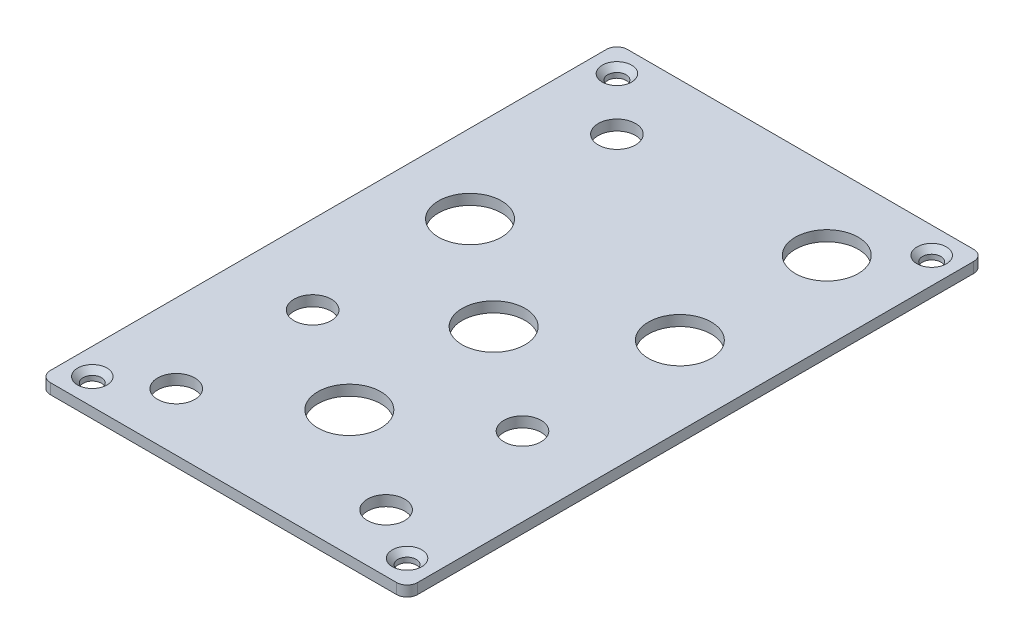
ISO-10303-21;
HEADER;
FILE_DESCRIPTION(('STEP AP214'),'2;1');
FILE_NAME('part.step','',(''),(''),'','','');
FILE_SCHEMA(('AUTOMOTIVE_DESIGN { 1 0 10303 214 1 1 1 1 }'));
ENDSEC;
DATA;
#1=APPLICATION_CONTEXT('core data for automotive mechanical design processes');
#2=APPLICATION_PROTOCOL_DEFINITION('international standard','automotive_design',2000,#1);
#3=PRODUCT_CONTEXT('',#1,'mechanical');
#4=PRODUCT('Part','Part','',(#3));
#5=PRODUCT_RELATED_PRODUCT_CATEGORY('part','',(#4));
#6=PRODUCT_DEFINITION_FORMATION('','',#4);
#7=PRODUCT_DEFINITION_CONTEXT('part definition',#1,'design');
#8=PRODUCT_DEFINITION('design','',#6,#7);
#9=PRODUCT_DEFINITION_SHAPE('','',#8);
#10=(LENGTH_UNIT() NAMED_UNIT(*) SI_UNIT(.MILLI.,.METRE.));
#11=(NAMED_UNIT(*) PLANE_ANGLE_UNIT() SI_UNIT($,.RADIAN.));
#12=(NAMED_UNIT(*) SI_UNIT($,.STERADIAN.) SOLID_ANGLE_UNIT());
#13=UNCERTAINTY_MEASURE_WITH_UNIT(LENGTH_MEASURE(1.E-05),#10,'distance_accuracy_value','');
#14=(GEOMETRIC_REPRESENTATION_CONTEXT(3) GLOBAL_UNCERTAINTY_ASSIGNED_CONTEXT((#13)) GLOBAL_UNIT_ASSIGNED_CONTEXT((#10,
#11,#12)) REPRESENTATION_CONTEXT('',''));
#15=CARTESIAN_POINT('',(0.,0.,0.));
#16=DIRECTION('',(0.,0.,1.));
#17=DIRECTION('',(1.,0.,0.));
#18=AXIS2_PLACEMENT_3D('',#15,#16,#17);
#19=CARTESIAN_POINT('',(-33.,2.,53.));
#20=DIRECTION('',(0.,-1.,0.));
#21=DIRECTION('',(0.,0.,-1.));
#22=AXIS2_PLACEMENT_3D('',#19,#20,#21);
#23=CYLINDRICAL_SURFACE('',#22,2.);
#24=DIRECTION('',(0.,-1.,0.));
#25=VECTOR('',#24,1.);
#26=CARTESIAN_POINT('',(-33.,2.,55.));
#27=LINE('',#26,#25);
#28=CARTESIAN_POINT('',(-33.,2.,55.));
#29=VERTEX_POINT('',#28);
#30=CARTESIAN_POINT('',(-33.,0.,55.));
#31=VERTEX_POINT('',#30);
#32=EDGE_CURVE('E218',#29,#31,#27,.T.);
#33=ORIENTED_EDGE('',*,*,#32,.F.);
#34=CARTESIAN_POINT('',(-33.,2.,53.));
#35=DIRECTION('',(0.,1.,0.));
#36=DIRECTION('',(0.,0.,1.));
#37=AXIS2_PLACEMENT_3D('',#34,#35,#36);
#38=CIRCLE('',#37,2.);
#39=CARTESIAN_POINT('',(-35.,2.,53.));
#40=VERTEX_POINT('',#39);
#41=EDGE_CURVE('E40',#40,#29,#38,.T.);
#42=ORIENTED_EDGE('',*,*,#41,.F.);
#43=DIRECTION('',(0.,-1.,0.));
#44=VECTOR('',#43,1.);
#45=CARTESIAN_POINT('',(-35.,2.,53.));
#46=LINE('',#45,#44);
#47=CARTESIAN_POINT('',(-35.,0.,53.));
#48=VERTEX_POINT('',#47);
#49=EDGE_CURVE('E221',#48,#40,#46,.F.);
#50=ORIENTED_EDGE('',*,*,#49,.F.);
#51=CARTESIAN_POINT('',(-33.,0.,53.));
#52=DIRECTION('',(0.,1.,0.));
#53=DIRECTION('',(0.,0.,1.));
#54=AXIS2_PLACEMENT_3D('',#51,#52,#53);
#55=CIRCLE('',#54,2.);
#56=EDGE_CURVE('E11',#31,#48,#55,.F.);
#57=ORIENTED_EDGE('',*,*,#56,.F.);
#58=EDGE_LOOP('',(#33,#42,#50,#57));
#59=FACE_BOUND('',#58,.T.);
#60=ADVANCED_FACE('F33',(#59),#23,.T.);
#61=CARTESIAN_POINT('',(33.,2.,53.));
#62=DIRECTION('',(0.,-1.,0.));
#63=DIRECTION('',(0.,0.,-1.));
#64=AXIS2_PLACEMENT_3D('',#61,#62,#63);
#65=CYLINDRICAL_SURFACE('',#64,2.);
#66=DIRECTION('',(0.,-1.,0.));
#67=VECTOR('',#66,1.);
#68=CARTESIAN_POINT('',(35.,2.,53.));
#69=LINE('',#68,#67);
#70=CARTESIAN_POINT('',(35.,2.,53.));
#71=VERTEX_POINT('',#70);
#72=CARTESIAN_POINT('',(35.,0.,53.));
#73=VERTEX_POINT('',#72);
#74=EDGE_CURVE('E207',#71,#73,#69,.T.);
#75=ORIENTED_EDGE('',*,*,#74,.F.);
#76=CARTESIAN_POINT('',(33.,2.,53.));
#77=DIRECTION('',(0.,1.,0.));
#78=DIRECTION('',(0.,0.,1.));
#79=AXIS2_PLACEMENT_3D('',#76,#77,#78);
#80=CIRCLE('',#79,2.);
#81=CARTESIAN_POINT('',(33.,2.,55.));
#82=VERTEX_POINT('',#81);
#83=EDGE_CURVE('E213',#82,#71,#80,.T.);
#84=ORIENTED_EDGE('',*,*,#83,.F.);
#85=DIRECTION('',(0.,-1.,0.));
#86=VECTOR('',#85,1.);
#87=CARTESIAN_POINT('',(33.,2.,55.));
#88=LINE('',#87,#86);
#89=CARTESIAN_POINT('',(33.,0.,55.));
#90=VERTEX_POINT('',#89);
#91=EDGE_CURVE('E210',#90,#82,#88,.F.);
#92=ORIENTED_EDGE('',*,*,#91,.F.);
#93=CARTESIAN_POINT('',(33.,0.,53.));
#94=DIRECTION('',(0.,1.,0.));
#95=DIRECTION('',(0.,0.,1.));
#96=AXIS2_PLACEMENT_3D('',#93,#94,#95);
#97=CIRCLE('',#96,2.);
#98=EDGE_CURVE('E215',#73,#90,#97,.F.);
#99=ORIENTED_EDGE('',*,*,#98,.F.);
#100=EDGE_LOOP('',(#75,#84,#92,#99));
#101=FACE_BOUND('',#100,.T.);
#102=ADVANCED_FACE('F311',(#101),#65,.T.);
#103=CARTESIAN_POINT('',(33.,2.,-53.));
#104=DIRECTION('',(0.,-1.,0.));
#105=DIRECTION('',(0.,0.,-1.));
#106=AXIS2_PLACEMENT_3D('',#103,#104,#105);
#107=CYLINDRICAL_SURFACE('',#106,2.);
#108=DIRECTION('',(0.,-1.,0.));
#109=VECTOR('',#108,1.);
#110=CARTESIAN_POINT('',(33.,2.,-55.));
#111=LINE('',#110,#109);
#112=CARTESIAN_POINT('',(33.,2.,-55.));
#113=VERTEX_POINT('',#112);
#114=CARTESIAN_POINT('',(33.,0.,-55.));
#115=VERTEX_POINT('',#114);
#116=EDGE_CURVE('E105',#113,#115,#111,.T.);
#117=ORIENTED_EDGE('',*,*,#116,.F.);
#118=CARTESIAN_POINT('',(33.,2.,-53.));
#119=DIRECTION('',(0.,1.,0.));
#120=DIRECTION('',(0.,0.,1.));
#121=AXIS2_PLACEMENT_3D('',#118,#119,#120);
#122=CIRCLE('',#121,2.);
#123=CARTESIAN_POINT('',(35.,2.,-53.));
#124=VERTEX_POINT('',#123);
#125=EDGE_CURVE('E202',#124,#113,#122,.T.);
#126=ORIENTED_EDGE('',*,*,#125,.F.);
#127=DIRECTION('',(0.,-1.,0.));
#128=VECTOR('',#127,1.);
#129=CARTESIAN_POINT('',(35.,2.,-53.));
#130=LINE('',#129,#128);
#131=CARTESIAN_POINT('',(35.,0.,-53.));
#132=VERTEX_POINT('',#131);
#133=EDGE_CURVE('E199',#132,#124,#130,.F.);
#134=ORIENTED_EDGE('',*,*,#133,.F.);
#135=CARTESIAN_POINT('',(33.,0.,-53.));
#136=DIRECTION('',(0.,1.,0.));
#137=DIRECTION('',(0.,0.,1.));
#138=AXIS2_PLACEMENT_3D('',#135,#136,#137);
#139=CIRCLE('',#138,2.);
#140=EDGE_CURVE('E204',#115,#132,#139,.F.);
#141=ORIENTED_EDGE('',*,*,#140,.F.);
#142=EDGE_LOOP('',(#117,#126,#134,#141));
#143=FACE_BOUND('',#142,.T.);
#144=ADVANCED_FACE('F316',(#143),#107,.T.);
#145=CARTESIAN_POINT('',(-33.,2.,-53.));
#146=DIRECTION('',(0.,-1.,0.));
#147=DIRECTION('',(0.,0.,-1.));
#148=AXIS2_PLACEMENT_3D('',#145,#146,#147);
#149=CYLINDRICAL_SURFACE('',#148,2.);
#150=DIRECTION('',(0.,-1.,0.));
#151=VECTOR('',#150,1.);
#152=CARTESIAN_POINT('',(-35.,2.,-53.));
#153=LINE('',#152,#151);
#154=CARTESIAN_POINT('',(-35.,2.,-53.));
#155=VERTEX_POINT('',#154);
#156=CARTESIAN_POINT('',(-35.,0.,-53.));
#157=VERTEX_POINT('',#156);
#158=EDGE_CURVE('E100',#155,#157,#153,.T.);
#159=ORIENTED_EDGE('',*,*,#158,.F.);
#160=CARTESIAN_POINT('',(-33.,2.,-53.));
#161=DIRECTION('',(0.,1.,0.));
#162=DIRECTION('',(0.,0.,1.));
#163=AXIS2_PLACEMENT_3D('',#160,#161,#162);
#164=CIRCLE('',#163,2.);
#165=CARTESIAN_POINT('',(-33.,2.,-55.));
#166=VERTEX_POINT('',#165);
#167=EDGE_CURVE('E106',#166,#155,#164,.T.);
#168=ORIENTED_EDGE('',*,*,#167,.F.);
#169=DIRECTION('',(0.,-1.,0.));
#170=VECTOR('',#169,1.);
#171=CARTESIAN_POINT('',(-33.,2.,-55.));
#172=LINE('',#171,#170);
#173=CARTESIAN_POINT('',(-33.,0.,-55.));
#174=VERTEX_POINT('',#173);
#175=EDGE_CURVE('E103',#174,#166,#172,.F.);
#176=ORIENTED_EDGE('',*,*,#175,.F.);
#177=CARTESIAN_POINT('',(-33.,0.,-53.));
#178=DIRECTION('',(0.,1.,0.));
#179=DIRECTION('',(0.,0.,1.));
#180=AXIS2_PLACEMENT_3D('',#177,#178,#179);
#181=CIRCLE('',#180,2.);
#182=EDGE_CURVE('E96',#157,#174,#181,.F.);
#183=ORIENTED_EDGE('',*,*,#182,.F.);
#184=EDGE_LOOP('',(#159,#168,#176,#183));
#185=FACE_BOUND('',#184,.T.);
#186=ADVANCED_FACE('F98',(#185),#149,.T.);
#187=CARTESIAN_POINT('',(-35.,2.,55.));
#188=DIRECTION('',(1.,0.,0.));
#189=DIRECTION('',(0.,0.,-1.));
#190=AXIS2_PLACEMENT_3D('',#187,#188,#189);
#191=PLANE('',#190);
#192=DIRECTION('',(0.,0.,1.));
#193=VECTOR('',#192,1.);
#194=CARTESIAN_POINT('',(-35.,0.,55.));
#195=LINE('',#194,#193);
#196=EDGE_CURVE('E111',#157,#48,#195,.T.);
#197=ORIENTED_EDGE('',*,*,#196,.T.);
#198=ORIENTED_EDGE('',*,*,#49,.T.);
#199=DIRECTION('',(0.,0.,1.));
#200=VECTOR('',#199,1.);
#201=CARTESIAN_POINT('',(-35.,2.,55.));
#202=LINE('',#201,#200);
#203=EDGE_CURVE('E113',#155,#40,#202,.T.);
#204=ORIENTED_EDGE('',*,*,#203,.F.);
#205=ORIENTED_EDGE('',*,*,#158,.T.);
#206=EDGE_LOOP('',(#197,#198,#204,#205));
#207=FACE_BOUND('',#206,.T.);
#208=ADVANCED_FACE('F110',(#207),#191,.F.);
#209=CARTESIAN_POINT('',(35.,2.,55.));
#210=DIRECTION('',(0.,0.,-1.));
#211=DIRECTION('',(-1.,0.,0.));
#212=AXIS2_PLACEMENT_3D('',#209,#210,#211);
#213=PLANE('',#212);
#214=DIRECTION('',(1.,0.,0.));
#215=VECTOR('',#214,1.);
#216=CARTESIAN_POINT('',(35.,2.,55.));
#217=LINE('',#216,#215);
#218=EDGE_CURVE('E225',#29,#82,#217,.T.);
#219=ORIENTED_EDGE('',*,*,#218,.F.);
#220=ORIENTED_EDGE('',*,*,#32,.T.);
#221=DIRECTION('',(1.,0.,0.));
#222=VECTOR('',#221,1.);
#223=CARTESIAN_POINT('',(35.,0.,55.));
#224=LINE('',#223,#222);
#225=EDGE_CURVE('E117',#31,#90,#224,.T.);
#226=ORIENTED_EDGE('',*,*,#225,.T.);
#227=ORIENTED_EDGE('',*,*,#91,.T.);
#228=EDGE_LOOP('',(#219,#220,#226,#227));
#229=FACE_BOUND('',#228,.T.);
#230=ADVANCED_FACE('F228',(#229),#213,.F.);
#231=CARTESIAN_POINT('',(35.,2.,55.));
#232=DIRECTION('',(-1.,0.,0.));
#233=DIRECTION('',(0.,0.,1.));
#234=AXIS2_PLACEMENT_3D('',#231,#232,#233);
#235=PLANE('',#234);
#236=DIRECTION('',(0.,0.,-1.));
#237=VECTOR('',#236,1.);
#238=CARTESIAN_POINT('',(35.,2.,55.));
#239=LINE('',#238,#237);
#240=EDGE_CURVE('E230',#71,#124,#239,.T.);
#241=ORIENTED_EDGE('',*,*,#240,.F.);
#242=ORIENTED_EDGE('',*,*,#74,.T.);
#243=DIRECTION('',(0.,0.,-1.));
#244=VECTOR('',#243,1.);
#245=CARTESIAN_POINT('',(35.,0.,55.));
#246=LINE('',#245,#244);
#247=EDGE_CURVE('E120',#73,#132,#246,.T.);
#248=ORIENTED_EDGE('',*,*,#247,.T.);
#249=ORIENTED_EDGE('',*,*,#133,.T.);
#250=EDGE_LOOP('',(#241,#242,#248,#249));
#251=FACE_BOUND('',#250,.T.);
#252=ADVANCED_FACE('F330',(#251),#235,.F.);
#253=CARTESIAN_POINT('',(35.,2.,-55.));
#254=DIRECTION('',(0.,0.,1.));
#255=DIRECTION('',(1.,0.,0.));
#256=AXIS2_PLACEMENT_3D('',#253,#254,#255);
#257=PLANE('',#256);
#258=DIRECTION('',(-1.,0.,0.));
#259=VECTOR('',#258,1.);
#260=CARTESIAN_POINT('',(35.,2.,-55.));
#261=LINE('',#260,#259);
#262=EDGE_CURVE('E114',#113,#166,#261,.T.);
#263=ORIENTED_EDGE('',*,*,#262,.F.);
#264=ORIENTED_EDGE('',*,*,#116,.T.);
#265=DIRECTION('',(-1.,0.,0.));
#266=VECTOR('',#265,1.);
#267=CARTESIAN_POINT('',(35.,0.,-55.));
#268=LINE('',#267,#266);
#269=EDGE_CURVE('E129',#115,#174,#268,.T.);
#270=ORIENTED_EDGE('',*,*,#269,.T.);
#271=ORIENTED_EDGE('',*,*,#175,.T.);
#272=EDGE_LOOP('',(#263,#264,#270,#271));
#273=FACE_BOUND('',#272,.T.);
#274=ADVANCED_FACE('F268',(#273),#257,.F.);
#275=CARTESIAN_POINT('',(0.,2.,0.));
#276=DIRECTION('',(0.,1.,0.));
#277=DIRECTION('',(0.,0.,1.));
#278=AXIS2_PLACEMENT_3D('',#275,#276,#277);
#279=PLANE('',#278);
#280=CARTESIAN_POINT('',(-30.,2.,50.));
#281=DIRECTION('',(0.,1.,0.));
#282=DIRECTION('',(0.,0.,1.));
#283=AXIS2_PLACEMENT_3D('',#280,#281,#282);
#284=CIRCLE('',#283,2.8);
#285=CARTESIAN_POINT('',(-30.,2.,52.8));
#286=VERTEX_POINT('',#285);
#287=EDGE_CURVE('E193',#286,#286,#284,.T.);
#288=ORIENTED_EDGE('',*,*,#287,.F.);
#289=EDGE_LOOP('',(#288));
#290=FACE_BOUND('',#289,.T.);
#291=CARTESIAN_POINT('',(30.,2.,50.));
#292=DIRECTION('',(0.,1.,0.));
#293=DIRECTION('',(0.,0.,1.));
#294=AXIS2_PLACEMENT_3D('',#291,#292,#293);
#295=CIRCLE('',#294,2.8);
#296=CARTESIAN_POINT('',(30.,2.,52.8));
#297=VERTEX_POINT('',#296);
#298=EDGE_CURVE('E190',#297,#297,#295,.T.);
#299=ORIENTED_EDGE('',*,*,#298,.F.);
#300=EDGE_LOOP('',(#299));
#301=FACE_BOUND('',#300,.T.);
#302=CARTESIAN_POINT('',(30.,2.,-50.));
#303=DIRECTION('',(0.,1.,0.));
#304=DIRECTION('',(0.,0.,1.));
#305=AXIS2_PLACEMENT_3D('',#302,#303,#304);
#306=CIRCLE('',#305,2.8);
#307=CARTESIAN_POINT('',(30.,2.,-47.2));
#308=VERTEX_POINT('',#307);
#309=EDGE_CURVE('E186',#308,#308,#306,.T.);
#310=ORIENTED_EDGE('',*,*,#309,.F.);
#311=EDGE_LOOP('',(#310));
#312=FACE_BOUND('',#311,.T.);
#313=CARTESIAN_POINT('',(-30.,2.,-50.));
#314=DIRECTION('',(0.,1.,0.));
#315=DIRECTION('',(0.,0.,1.));
#316=AXIS2_PLACEMENT_3D('',#313,#314,#315);
#317=CIRCLE('',#316,2.8);
#318=CARTESIAN_POINT('',(-30.,2.,-47.2));
#319=VERTEX_POINT('',#318);
#320=EDGE_CURVE('E182',#319,#319,#317,.T.);
#321=ORIENTED_EDGE('',*,*,#320,.F.);
#322=EDGE_LOOP('',(#321));
#323=FACE_BOUND('',#322,.T.);
#324=CARTESIAN_POINT('',(0.,2.,3.49999999999999));
#325=DIRECTION('',(0.,1.,0.));
#326=DIRECTION('',(0.,0.,1.));
#327=AXIS2_PLACEMENT_3D('',#324,#325,#326);
#328=CIRCLE('',#327,6.);
#329=CARTESIAN_POINT('',(0.,2.,9.49999999999999));
#330=VERTEX_POINT('',#329);
#331=EDGE_CURVE('E166',#330,#330,#328,.T.);
#332=ORIENTED_EDGE('',*,*,#331,.F.);
#333=EDGE_LOOP('',(#332));
#334=FACE_BOUND('',#333,.T.);
#335=CARTESIAN_POINT('',(20.,2.,44.));
#336=DIRECTION('',(0.,1.,0.));
#337=DIRECTION('',(0.,0.,1.));
#338=AXIS2_PLACEMENT_3D('',#335,#336,#337);
#339=CIRCLE('',#338,3.55);
#340=CARTESIAN_POINT('',(20.,2.,47.55));
#341=VERTEX_POINT('',#340);
#342=EDGE_CURVE('E162',#341,#341,#339,.T.);
#343=ORIENTED_EDGE('',*,*,#342,.F.);
#344=EDGE_LOOP('',(#343));
#345=FACE_BOUND('',#344,.T.);
#346=CARTESIAN_POINT('',(20.,2.,-40.));
#347=DIRECTION('',(0.,1.,0.));
#348=DIRECTION('',(0.,0.,-1.));
#349=AXIS2_PLACEMENT_3D('',#346,#347,#348);
#350=CIRCLE('',#349,6.);
#351=CARTESIAN_POINT('',(20.,2.,-46.));
#352=VERTEX_POINT('',#351);
#353=EDGE_CURVE('E158',#352,#352,#350,.T.);
#354=ORIENTED_EDGE('',*,*,#353,.F.);
#355=EDGE_LOOP('',(#354));
#356=FACE_BOUND('',#355,.T.);
#357=CARTESIAN_POINT('',(20.,2.,18.));
#358=DIRECTION('',(0.,1.,0.));
#359=DIRECTION('',(0.,0.,1.));
#360=AXIS2_PLACEMENT_3D('',#357,#358,#359);
#361=CIRCLE('',#360,3.55);
#362=CARTESIAN_POINT('',(20.,2.,21.55));
#363=VERTEX_POINT('',#362);
#364=EDGE_CURVE('E154',#363,#363,#361,.T.);
#365=ORIENTED_EDGE('',*,*,#364,.F.);
#366=EDGE_LOOP('',(#365));
#367=FACE_BOUND('',#366,.T.);
#368=CARTESIAN_POINT('',(-20.,2.,44.));
#369=DIRECTION('',(0.,1.,0.));
#370=DIRECTION('',(0.,0.,1.));
#371=AXIS2_PLACEMENT_3D('',#368,#369,#370);
#372=CIRCLE('',#371,3.55);
#373=CARTESIAN_POINT('',(-20.,2.,47.55));
#374=VERTEX_POINT('',#373);
#375=EDGE_CURVE('E150',#374,#374,#372,.T.);
#376=ORIENTED_EDGE('',*,*,#375,.F.);
#377=EDGE_LOOP('',(#376));
#378=FACE_BOUND('',#377,.T.);
#379=CARTESIAN_POINT('',(0.,2.,31.));
#380=DIRECTION('',(0.,1.,0.));
#381=DIRECTION('',(0.,0.,1.));
#382=AXIS2_PLACEMENT_3D('',#379,#380,#381);
#383=CIRCLE('',#382,6.);
#384=CARTESIAN_POINT('',(0.,2.,37.));
#385=VERTEX_POINT('',#384);
#386=EDGE_CURVE('E146',#385,#385,#383,.T.);
#387=ORIENTED_EDGE('',*,*,#386,.F.);
#388=EDGE_LOOP('',(#387));
#389=FACE_BOUND('',#388,.T.);
#390=CARTESIAN_POINT('',(-20.,2.,-40.));
#391=DIRECTION('',(0.,1.,0.));
#392=DIRECTION('',(0.,0.,1.));
#393=AXIS2_PLACEMENT_3D('',#390,#391,#392);
#394=CIRCLE('',#393,3.55);
#395=CARTESIAN_POINT('',(-20.,2.,-36.45));
#396=VERTEX_POINT('',#395);
#397=EDGE_CURVE('E142',#396,#396,#394,.T.);
#398=ORIENTED_EDGE('',*,*,#397,.F.);
#399=EDGE_LOOP('',(#398));
#400=FACE_BOUND('',#399,.T.);
#401=CARTESIAN_POINT('',(-20.,2.,18.));
#402=DIRECTION('',(0.,1.,0.));
#403=DIRECTION('',(0.,0.,1.));
#404=AXIS2_PLACEMENT_3D('',#401,#402,#403);
#405=CIRCLE('',#404,3.55);
#406=CARTESIAN_POINT('',(-20.,2.,21.55));
#407=VERTEX_POINT('',#406);
#408=EDGE_CURVE('E138',#407,#407,#405,.T.);
#409=ORIENTED_EDGE('',*,*,#408,.F.);
#410=EDGE_LOOP('',(#409));
#411=FACE_BOUND('',#410,.T.);
#412=CARTESIAN_POINT('',(20.,2.,-12.));
#413=DIRECTION('',(0.,1.,0.));
#414=DIRECTION('',(0.,0.,1.));
#415=AXIS2_PLACEMENT_3D('',#412,#413,#414);
#416=CIRCLE('',#415,6.);
#417=CARTESIAN_POINT('',(20.,2.,-6.00000000000001));
#418=VERTEX_POINT('',#417);
#419=EDGE_CURVE('E134',#418,#418,#416,.T.);
#420=ORIENTED_EDGE('',*,*,#419,.F.);
#421=EDGE_LOOP('',(#420));
#422=FACE_BOUND('',#421,.T.);
#423=CARTESIAN_POINT('',(-20.,2.,-12.));
#424=DIRECTION('',(0.,1.,0.));
#425=DIRECTION('',(0.,0.,1.));
#426=AXIS2_PLACEMENT_3D('',#423,#424,#425);
#427=CIRCLE('',#426,6.00000000000001);
#428=CARTESIAN_POINT('',(-20.,2.,-6.));
#429=VERTEX_POINT('',#428);
#430=EDGE_CURVE('E123',#429,#429,#427,.T.);
#431=ORIENTED_EDGE('',*,*,#430,.F.);
#432=EDGE_LOOP('',(#431));
#433=FACE_BOUND('',#432,.T.);
#434=ORIENTED_EDGE('',*,*,#203,.T.);
#435=ORIENTED_EDGE('',*,*,#41,.T.);
#436=ORIENTED_EDGE('',*,*,#218,.T.);
#437=ORIENTED_EDGE('',*,*,#83,.T.);
#438=ORIENTED_EDGE('',*,*,#240,.T.);
#439=ORIENTED_EDGE('',*,*,#125,.T.);
#440=ORIENTED_EDGE('',*,*,#262,.T.);
#441=ORIENTED_EDGE('',*,*,#167,.T.);
#442=EDGE_LOOP('',(#434,#435,#436,#437,#438,#439,#440,#441));
#443=FACE_BOUND('',#442,.T.);
#444=ADVANCED_FACE('F223',(#290,#301,#312,#323,#334,#345,#356,#367,#378,#389,#400,#411,#422,
#433,#443),#279,.T.);
#445=CARTESIAN_POINT('',(0.,0.,0.));
#446=DIRECTION('',(0.,1.,0.));
#447=DIRECTION('',(0.,0.,1.));
#448=AXIS2_PLACEMENT_3D('',#445,#446,#447);
#449=PLANE('',#448);
#450=CARTESIAN_POINT('',(30.,0.,50.));
#451=DIRECTION('',(0.,1.,0.));
#452=DIRECTION('',(0.,0.,1.));
#453=AXIS2_PLACEMENT_3D('',#450,#451,#452);
#454=CIRCLE('',#453,1.75);
#455=CARTESIAN_POINT('',(30.,0.,51.75));
#456=VERTEX_POINT('',#455);
#457=EDGE_CURVE('E176',#456,#456,#454,.T.);
#458=ORIENTED_EDGE('',*,*,#457,.T.);
#459=EDGE_LOOP('',(#458));
#460=FACE_BOUND('',#459,.T.);
#461=CARTESIAN_POINT('',(-30.,0.,50.));
#462=DIRECTION('',(0.,1.,0.));
#463=DIRECTION('',(0.,0.,1.));
#464=AXIS2_PLACEMENT_3D('',#461,#462,#463);
#465=CIRCLE('',#464,1.75);
#466=CARTESIAN_POINT('',(-30.,0.,51.75));
#467=VERTEX_POINT('',#466);
#468=EDGE_CURVE('E173',#467,#467,#465,.T.);
#469=ORIENTED_EDGE('',*,*,#468,.T.);
#470=EDGE_LOOP('',(#469));
#471=FACE_BOUND('',#470,.T.);
#472=CARTESIAN_POINT('',(30.,0.,-50.));
#473=DIRECTION('',(0.,1.,0.));
#474=DIRECTION('',(0.,0.,1.));
#475=AXIS2_PLACEMENT_3D('',#472,#473,#474);
#476=CIRCLE('',#475,1.75);
#477=CARTESIAN_POINT('',(30.,0.,-48.25));
#478=VERTEX_POINT('',#477);
#479=EDGE_CURVE('E170',#478,#478,#476,.T.);
#480=ORIENTED_EDGE('',*,*,#479,.T.);
#481=EDGE_LOOP('',(#480));
#482=FACE_BOUND('',#481,.T.);
#483=CARTESIAN_POINT('',(-30.,0.,-50.));
#484=DIRECTION('',(0.,1.,0.));
#485=DIRECTION('',(0.,0.,1.));
#486=AXIS2_PLACEMENT_3D('',#483,#484,#485);
#487=CIRCLE('',#486,1.75);
#488=CARTESIAN_POINT('',(-30.,0.,-48.25));
#489=VERTEX_POINT('',#488);
#490=EDGE_CURVE('E167',#489,#489,#487,.T.);
#491=ORIENTED_EDGE('',*,*,#490,.T.);
#492=EDGE_LOOP('',(#491));
#493=FACE_BOUND('',#492,.T.);
#494=CARTESIAN_POINT('',(0.,0.,3.49999999999999));
#495=DIRECTION('',(0.,1.,0.));
#496=DIRECTION('',(0.,0.,1.));
#497=AXIS2_PLACEMENT_3D('',#494,#495,#496);
#498=CIRCLE('',#497,6.);
#499=CARTESIAN_POINT('',(0.,0.,9.49999999999999));
#500=VERTEX_POINT('',#499);
#501=EDGE_CURVE('E163',#500,#500,#498,.T.);
#502=ORIENTED_EDGE('',*,*,#501,.T.);
#503=EDGE_LOOP('',(#502));
#504=FACE_BOUND('',#503,.T.);
#505=CARTESIAN_POINT('',(20.,0.,44.));
#506=DIRECTION('',(0.,1.,0.));
#507=DIRECTION('',(0.,0.,1.));
#508=AXIS2_PLACEMENT_3D('',#505,#506,#507);
#509=CIRCLE('',#508,3.55);
#510=CARTESIAN_POINT('',(20.,0.,47.55));
#511=VERTEX_POINT('',#510);
#512=EDGE_CURVE('E159',#511,#511,#509,.T.);
#513=ORIENTED_EDGE('',*,*,#512,.T.);
#514=EDGE_LOOP('',(#513));
#515=FACE_BOUND('',#514,.T.);
#516=CARTESIAN_POINT('',(20.,0.,-40.));
#517=DIRECTION('',(0.,1.,0.));
#518=DIRECTION('',(0.,0.,1.));
#519=AXIS2_PLACEMENT_3D('',#516,#517,#518);
#520=CIRCLE('',#519,6.);
#521=CARTESIAN_POINT('',(20.,0.,-34.));
#522=VERTEX_POINT('',#521);
#523=EDGE_CURVE('E155',#522,#522,#520,.T.);
#524=ORIENTED_EDGE('',*,*,#523,.T.);
#525=EDGE_LOOP('',(#524));
#526=FACE_BOUND('',#525,.T.);
#527=CARTESIAN_POINT('',(20.,0.,18.));
#528=DIRECTION('',(0.,1.,0.));
#529=DIRECTION('',(0.,0.,1.));
#530=AXIS2_PLACEMENT_3D('',#527,#528,#529);
#531=CIRCLE('',#530,3.55);
#532=CARTESIAN_POINT('',(20.,0.,21.55));
#533=VERTEX_POINT('',#532);
#534=EDGE_CURVE('E151',#533,#533,#531,.T.);
#535=ORIENTED_EDGE('',*,*,#534,.T.);
#536=EDGE_LOOP('',(#535));
#537=FACE_BOUND('',#536,.T.);
#538=CARTESIAN_POINT('',(-20.,0.,44.));
#539=DIRECTION('',(0.,1.,0.));
#540=DIRECTION('',(0.,0.,1.));
#541=AXIS2_PLACEMENT_3D('',#538,#539,#540);
#542=CIRCLE('',#541,3.55);
#543=CARTESIAN_POINT('',(-20.,0.,47.55));
#544=VERTEX_POINT('',#543);
#545=EDGE_CURVE('E147',#544,#544,#542,.T.);
#546=ORIENTED_EDGE('',*,*,#545,.T.);
#547=EDGE_LOOP('',(#546));
#548=FACE_BOUND('',#547,.T.);
#549=CARTESIAN_POINT('',(0.,0.,31.));
#550=DIRECTION('',(0.,1.,0.));
#551=DIRECTION('',(0.,0.,1.));
#552=AXIS2_PLACEMENT_3D('',#549,#550,#551);
#553=CIRCLE('',#552,6.);
#554=CARTESIAN_POINT('',(0.,0.,37.));
#555=VERTEX_POINT('',#554);
#556=EDGE_CURVE('E143',#555,#555,#553,.T.);
#557=ORIENTED_EDGE('',*,*,#556,.T.);
#558=EDGE_LOOP('',(#557));
#559=FACE_BOUND('',#558,.T.);
#560=CARTESIAN_POINT('',(-20.,0.,-40.));
#561=DIRECTION('',(0.,1.,0.));
#562=DIRECTION('',(0.,0.,1.));
#563=AXIS2_PLACEMENT_3D('',#560,#561,#562);
#564=CIRCLE('',#563,3.55);
#565=CARTESIAN_POINT('',(-20.,0.,-36.45));
#566=VERTEX_POINT('',#565);
#567=EDGE_CURVE('E139',#566,#566,#564,.T.);
#568=ORIENTED_EDGE('',*,*,#567,.T.);
#569=EDGE_LOOP('',(#568));
#570=FACE_BOUND('',#569,.T.);
#571=CARTESIAN_POINT('',(-20.,0.,18.));
#572=DIRECTION('',(0.,1.,0.));
#573=DIRECTION('',(0.,0.,1.));
#574=AXIS2_PLACEMENT_3D('',#571,#572,#573);
#575=CIRCLE('',#574,3.55);
#576=CARTESIAN_POINT('',(-20.,0.,21.55));
#577=VERTEX_POINT('',#576);
#578=EDGE_CURVE('E135',#577,#577,#575,.T.);
#579=ORIENTED_EDGE('',*,*,#578,.T.);
#580=EDGE_LOOP('',(#579));
#581=FACE_BOUND('',#580,.T.);
#582=CARTESIAN_POINT('',(20.,0.,-12.));
#583=DIRECTION('',(0.,1.,0.));
#584=DIRECTION('',(0.,0.,1.));
#585=AXIS2_PLACEMENT_3D('',#582,#583,#584);
#586=CIRCLE('',#585,6.);
#587=CARTESIAN_POINT('',(20.,0.,-6.00000000000001));
#588=VERTEX_POINT('',#587);
#589=EDGE_CURVE('E131',#588,#588,#586,.T.);
#590=ORIENTED_EDGE('',*,*,#589,.T.);
#591=EDGE_LOOP('',(#590));
#592=FACE_BOUND('',#591,.T.);
#593=CARTESIAN_POINT('',(-20.,0.,-12.));
#594=DIRECTION('',(0.,1.,0.));
#595=DIRECTION('',(0.,0.,1.));
#596=AXIS2_PLACEMENT_3D('',#593,#594,#595);
#597=CIRCLE('',#596,6.00000000000001);
#598=CARTESIAN_POINT('',(-20.,0.,-6.));
#599=VERTEX_POINT('',#598);
#600=EDGE_CURVE('E118',#599,#599,#597,.T.);
#601=ORIENTED_EDGE('',*,*,#600,.T.);
#602=EDGE_LOOP('',(#601));
#603=FACE_BOUND('',#602,.T.);
#604=ORIENTED_EDGE('',*,*,#225,.F.);
#605=ORIENTED_EDGE('',*,*,#56,.T.);
#606=ORIENTED_EDGE('',*,*,#196,.F.);
#607=ORIENTED_EDGE('',*,*,#182,.T.);
#608=ORIENTED_EDGE('',*,*,#269,.F.);
#609=ORIENTED_EDGE('',*,*,#140,.T.);
#610=ORIENTED_EDGE('',*,*,#247,.F.);
#611=ORIENTED_EDGE('',*,*,#98,.T.);
#612=EDGE_LOOP('',(#604,#605,#606,#607,#608,#609,#610,#611));
#613=FACE_BOUND('',#612,.T.);
#614=ADVANCED_FACE('F116',(#460,#471,#482,#493,#504,#515,#526,#537,#548,#559,#570,#581,#592,
#603,#613),#449,.F.);
#615=CARTESIAN_POINT('',(-20.,-8.,-12.));
#616=DIRECTION('',(0.,1.,0.));
#617=DIRECTION('',(0.,0.,1.));
#618=AXIS2_PLACEMENT_3D('',#615,#616,#617);
#619=CYLINDRICAL_SURFACE('',#618,6.00000000000001);
#620=ORIENTED_EDGE('',*,*,#430,.T.);
#621=EDGE_LOOP('',(#620));
#622=FACE_BOUND('',#621,.T.);
#623=ORIENTED_EDGE('',*,*,#600,.F.);
#624=EDGE_LOOP('',(#623));
#625=FACE_BOUND('',#624,.T.);
#626=ADVANCED_FACE('F296',(#622,#625),#619,.F.);
#627=CARTESIAN_POINT('',(20.,-8.,-12.));
#628=DIRECTION('',(0.,1.,0.));
#629=DIRECTION('',(0.,0.,1.));
#630=AXIS2_PLACEMENT_3D('',#627,#628,#629);
#631=CYLINDRICAL_SURFACE('',#630,6.);
#632=ORIENTED_EDGE('',*,*,#419,.T.);
#633=EDGE_LOOP('',(#632));
#634=FACE_BOUND('',#633,.T.);
#635=ORIENTED_EDGE('',*,*,#589,.F.);
#636=EDGE_LOOP('',(#635));
#637=FACE_BOUND('',#636,.T.);
#638=ADVANCED_FACE('F299',(#634,#637),#631,.F.);
#639=CARTESIAN_POINT('',(-20.,-8.,18.));
#640=DIRECTION('',(0.,1.,0.));
#641=DIRECTION('',(0.,0.,1.));
#642=AXIS2_PLACEMENT_3D('',#639,#640,#641);
#643=CYLINDRICAL_SURFACE('',#642,3.55);
#644=ORIENTED_EDGE('',*,*,#408,.T.);
#645=EDGE_LOOP('',(#644));
#646=FACE_BOUND('',#645,.T.);
#647=ORIENTED_EDGE('',*,*,#578,.F.);
#648=EDGE_LOOP('',(#647));
#649=FACE_BOUND('',#648,.T.);
#650=ADVANCED_FACE('F387',(#646,#649),#643,.F.);
#651=CARTESIAN_POINT('',(-20.,-8.,-40.));
#652=DIRECTION('',(0.,1.,0.));
#653=DIRECTION('',(0.,0.,1.));
#654=AXIS2_PLACEMENT_3D('',#651,#652,#653);
#655=CYLINDRICAL_SURFACE('',#654,3.55);
#656=ORIENTED_EDGE('',*,*,#397,.T.);
#657=EDGE_LOOP('',(#656));
#658=FACE_BOUND('',#657,.T.);
#659=ORIENTED_EDGE('',*,*,#567,.F.);
#660=EDGE_LOOP('',(#659));
#661=FACE_BOUND('',#660,.T.);
#662=ADVANCED_FACE('F395',(#658,#661),#655,.F.);
#663=CARTESIAN_POINT('',(0.,-8.,31.));
#664=DIRECTION('',(0.,1.,0.));
#665=DIRECTION('',(0.,0.,1.));
#666=AXIS2_PLACEMENT_3D('',#663,#664,#665);
#667=CYLINDRICAL_SURFACE('',#666,6.);
#668=ORIENTED_EDGE('',*,*,#386,.T.);
#669=EDGE_LOOP('',(#668));
#670=FACE_BOUND('',#669,.T.);
#671=ORIENTED_EDGE('',*,*,#556,.F.);
#672=EDGE_LOOP('',(#671));
#673=FACE_BOUND('',#672,.T.);
#674=ADVANCED_FACE('F403',(#670,#673),#667,.F.);
#675=CARTESIAN_POINT('',(-20.,-8.,44.));
#676=DIRECTION('',(0.,1.,0.));
#677=DIRECTION('',(0.,0.,1.));
#678=AXIS2_PLACEMENT_3D('',#675,#676,#677);
#679=CYLINDRICAL_SURFACE('',#678,3.55);
#680=ORIENTED_EDGE('',*,*,#375,.T.);
#681=EDGE_LOOP('',(#680));
#682=FACE_BOUND('',#681,.T.);
#683=ORIENTED_EDGE('',*,*,#545,.F.);
#684=EDGE_LOOP('',(#683));
#685=FACE_BOUND('',#684,.T.);
#686=ADVANCED_FACE('F411',(#682,#685),#679,.F.);
#687=CARTESIAN_POINT('',(20.,-8.,18.));
#688=DIRECTION('',(0.,1.,0.));
#689=DIRECTION('',(0.,0.,1.));
#690=AXIS2_PLACEMENT_3D('',#687,#688,#689);
#691=CYLINDRICAL_SURFACE('',#690,3.55);
#692=ORIENTED_EDGE('',*,*,#364,.T.);
#693=EDGE_LOOP('',(#692));
#694=FACE_BOUND('',#693,.T.);
#695=ORIENTED_EDGE('',*,*,#534,.F.);
#696=EDGE_LOOP('',(#695));
#697=FACE_BOUND('',#696,.T.);
#698=ADVANCED_FACE('F419',(#694,#697),#691,.F.);
#699=CARTESIAN_POINT('',(20.,-8.,-40.));
#700=DIRECTION('',(0.,1.,0.));
#701=DIRECTION('',(0.,0.,1.));
#702=AXIS2_PLACEMENT_3D('',#699,#700,#701);
#703=CYLINDRICAL_SURFACE('',#702,6.);
#704=ORIENTED_EDGE('',*,*,#353,.T.);
#705=EDGE_LOOP('',(#704));
#706=FACE_BOUND('',#705,.T.);
#707=ORIENTED_EDGE('',*,*,#523,.F.);
#708=EDGE_LOOP('',(#707));
#709=FACE_BOUND('',#708,.T.);
#710=ADVANCED_FACE('F427',(#706,#709),#703,.F.);
#711=CARTESIAN_POINT('',(20.,-8.,44.));
#712=DIRECTION('',(0.,1.,0.));
#713=DIRECTION('',(0.,0.,1.));
#714=AXIS2_PLACEMENT_3D('',#711,#712,#713);
#715=CYLINDRICAL_SURFACE('',#714,3.55);
#716=ORIENTED_EDGE('',*,*,#342,.T.);
#717=EDGE_LOOP('',(#716));
#718=FACE_BOUND('',#717,.T.);
#719=ORIENTED_EDGE('',*,*,#512,.F.);
#720=EDGE_LOOP('',(#719));
#721=FACE_BOUND('',#720,.T.);
#722=ADVANCED_FACE('F435',(#718,#721),#715,.F.);
#723=CARTESIAN_POINT('',(0.,-8.,3.49999999999999));
#724=DIRECTION('',(0.,1.,0.));
#725=DIRECTION('',(0.,0.,1.));
#726=AXIS2_PLACEMENT_3D('',#723,#724,#725);
#727=CYLINDRICAL_SURFACE('',#726,6.);
#728=ORIENTED_EDGE('',*,*,#331,.T.);
#729=EDGE_LOOP('',(#728));
#730=FACE_BOUND('',#729,.T.);
#731=ORIENTED_EDGE('',*,*,#501,.F.);
#732=EDGE_LOOP('',(#731));
#733=FACE_BOUND('',#732,.T.);
#734=ADVANCED_FACE('F443',(#730,#733),#727,.F.);
#735=CARTESIAN_POINT('',(-30.,-8.,-50.));
#736=DIRECTION('',(0.,1.,0.));
#737=DIRECTION('',(0.,0.,1.));
#738=AXIS2_PLACEMENT_3D('',#735,#736,#737);
#739=CYLINDRICAL_SURFACE('',#738,1.75);
#740=CARTESIAN_POINT('',(-30.,0.950000000000005,-50.));
#741=DIRECTION('',(0.,1.,0.));
#742=DIRECTION('',(0.,0.,1.));
#743=AXIS2_PLACEMENT_3D('',#740,#741,#742);
#744=CIRCLE('',#743,1.75);
#745=CARTESIAN_POINT('',(-30.,0.950000000000005,-48.25));
#746=VERTEX_POINT('',#745);
#747=EDGE_CURVE('E179',#746,#746,#744,.T.);
#748=ORIENTED_EDGE('',*,*,#747,.T.);
#749=EDGE_LOOP('',(#748));
#750=FACE_BOUND('',#749,.T.);
#751=ORIENTED_EDGE('',*,*,#490,.F.);
#752=EDGE_LOOP('',(#751));
#753=FACE_BOUND('',#752,.T.);
#754=ADVANCED_FACE('F451',(#750,#753),#739,.F.);
#755=CARTESIAN_POINT('',(30.,-8.,-50.));
#756=DIRECTION('',(0.,1.,0.));
#757=DIRECTION('',(0.,0.,1.));
#758=AXIS2_PLACEMENT_3D('',#755,#756,#757);
#759=CYLINDRICAL_SURFACE('',#758,1.75);
#760=CARTESIAN_POINT('',(30.,0.950000000000003,-50.));
#761=DIRECTION('',(0.,1.,0.));
#762=DIRECTION('',(0.,0.,1.));
#763=AXIS2_PLACEMENT_3D('',#760,#761,#762);
#764=CIRCLE('',#763,1.75);
#765=CARTESIAN_POINT('',(30.,0.950000000000003,-48.25));
#766=VERTEX_POINT('',#765);
#767=EDGE_CURVE('E183',#766,#766,#764,.T.);
#768=ORIENTED_EDGE('',*,*,#767,.T.);
#769=EDGE_LOOP('',(#768));
#770=FACE_BOUND('',#769,.T.);
#771=ORIENTED_EDGE('',*,*,#479,.F.);
#772=EDGE_LOOP('',(#771));
#773=FACE_BOUND('',#772,.T.);
#774=ADVANCED_FACE('F459',(#770,#773),#759,.F.);
#775=CARTESIAN_POINT('',(-30.,-8.,50.));
#776=DIRECTION('',(0.,1.,0.));
#777=DIRECTION('',(0.,0.,1.));
#778=AXIS2_PLACEMENT_3D('',#775,#776,#777);
#779=CYLINDRICAL_SURFACE('',#778,1.75);
#780=CARTESIAN_POINT('',(-30.,0.950000000000006,50.));
#781=DIRECTION('',(0.,1.,0.));
#782=DIRECTION('',(0.,0.,1.));
#783=AXIS2_PLACEMENT_3D('',#780,#781,#782);
#784=CIRCLE('',#783,1.75);
#785=CARTESIAN_POINT('',(-30.,0.950000000000006,51.75));
#786=VERTEX_POINT('',#785);
#787=EDGE_CURVE('E191',#786,#786,#784,.T.);
#788=ORIENTED_EDGE('',*,*,#787,.T.);
#789=EDGE_LOOP('',(#788));
#790=FACE_BOUND('',#789,.T.);
#791=ORIENTED_EDGE('',*,*,#468,.F.);
#792=EDGE_LOOP('',(#791));
#793=FACE_BOUND('',#792,.T.);
#794=ADVANCED_FACE('F467',(#790,#793),#779,.F.);
#795=CARTESIAN_POINT('',(30.,-8.,50.));
#796=DIRECTION('',(0.,1.,0.));
#797=DIRECTION('',(0.,0.,1.));
#798=AXIS2_PLACEMENT_3D('',#795,#796,#797);
#799=CYLINDRICAL_SURFACE('',#798,1.75);
#800=CARTESIAN_POINT('',(30.,0.95000000000001,50.));
#801=DIRECTION('',(0.,1.,0.));
#802=DIRECTION('',(0.,0.,1.));
#803=AXIS2_PLACEMENT_3D('',#800,#801,#802);
#804=CIRCLE('',#803,1.75);
#805=CARTESIAN_POINT('',(30.,0.95000000000001,51.75));
#806=VERTEX_POINT('',#805);
#807=EDGE_CURVE('E187',#806,#806,#804,.T.);
#808=ORIENTED_EDGE('',*,*,#807,.T.);
#809=EDGE_LOOP('',(#808));
#810=FACE_BOUND('',#809,.T.);
#811=ORIENTED_EDGE('',*,*,#457,.F.);
#812=EDGE_LOOP('',(#811));
#813=FACE_BOUND('',#812,.T.);
#814=ADVANCED_FACE('F475',(#810,#813),#799,.F.);
#815=CARTESIAN_POINT('',(-30.,2.,-50.));
#816=DIRECTION('',(0.,1.,0.));
#817=DIRECTION('',(0.,0.,1.));
#818=AXIS2_PLACEMENT_3D('',#815,#816,#817);
#819=CONICAL_SURFACE('',#818,2.8,0.78539816339745);
#820=ORIENTED_EDGE('',*,*,#320,.T.);
#821=EDGE_LOOP('',(#820));
#822=FACE_BOUND('',#821,.T.);
#823=ORIENTED_EDGE('',*,*,#747,.F.);
#824=EDGE_LOOP('',(#823));
#825=FACE_BOUND('',#824,.T.);
#826=ADVANCED_FACE('F483',(#822,#825),#819,.F.);
#827=CARTESIAN_POINT('',(30.,2.,-50.));
#828=DIRECTION('',(0.,1.,0.));
#829=DIRECTION('',(0.,0.,1.));
#830=AXIS2_PLACEMENT_3D('',#827,#828,#829);
#831=CONICAL_SURFACE('',#830,2.8,0.78539816339745);
#832=ORIENTED_EDGE('',*,*,#309,.T.);
#833=EDGE_LOOP('',(#832));
#834=FACE_BOUND('',#833,.T.);
#835=ORIENTED_EDGE('',*,*,#767,.F.);
#836=EDGE_LOOP('',(#835));
#837=FACE_BOUND('',#836,.T.);
#838=ADVANCED_FACE('F491',(#834,#837),#831,.F.);
#839=CARTESIAN_POINT('',(30.,2.,50.));
#840=DIRECTION('',(0.,1.,0.));
#841=DIRECTION('',(0.,0.,1.));
#842=AXIS2_PLACEMENT_3D('',#839,#840,#841);
#843=CONICAL_SURFACE('',#842,2.8,0.78539816339745);
#844=ORIENTED_EDGE('',*,*,#298,.T.);
#845=EDGE_LOOP('',(#844));
#846=FACE_BOUND('',#845,.T.);
#847=ORIENTED_EDGE('',*,*,#807,.F.);
#848=EDGE_LOOP('',(#847));
#849=FACE_BOUND('',#848,.T.);
#850=ADVANCED_FACE('F499',(#846,#849),#843,.F.);
#851=CARTESIAN_POINT('',(-30.,2.,50.));
#852=DIRECTION('',(0.,1.,0.));
#853=DIRECTION('',(0.,0.,1.));
#854=AXIS2_PLACEMENT_3D('',#851,#852,#853);
#855=CONICAL_SURFACE('',#854,2.8,0.78539816339745);
#856=ORIENTED_EDGE('',*,*,#287,.T.);
#857=EDGE_LOOP('',(#856));
#858=FACE_BOUND('',#857,.T.);
#859=ORIENTED_EDGE('',*,*,#787,.F.);
#860=EDGE_LOOP('',(#859));
#861=FACE_BOUND('',#860,.T.);
#862=ADVANCED_FACE('F263',(#858,#861),#855,.F.);
#863=CLOSED_SHELL('',(#60,#102,#144,#186,#208,#230,#252,#274,#444,#614,#626,#638,#650,#662,#674,
#686,#698,#710,#722,#734,#754,#774,#794,#814,#826,#838,#850,#862));
#864=MANIFOLD_SOLID_BREP('B2',#863);
#865=ADVANCED_BREP_SHAPE_REPRESENTATION('',(#18,#864),#14);
#866=SHAPE_DEFINITION_REPRESENTATION(#9,#865);
ENDSEC;
END-ISO-10303-21;
